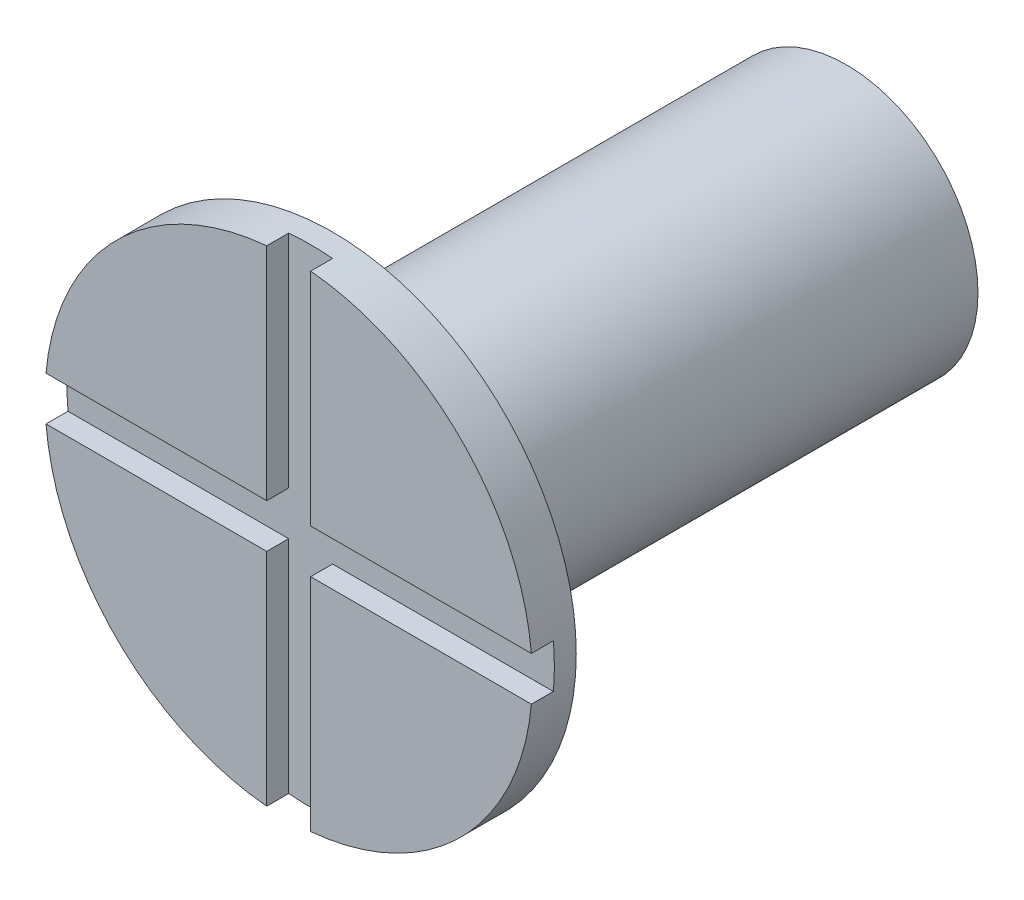
ISO-10303-21;
HEADER;
FILE_DESCRIPTION(('STEP AP214'),'2;1');
FILE_NAME('part.step','',(''),(''),'','','');
FILE_SCHEMA(('AUTOMOTIVE_DESIGN { 1 0 10303 214 1 1 1 1 }'));
ENDSEC;
DATA;
#1=APPLICATION_CONTEXT('core data for automotive mechanical design processes');
#2=APPLICATION_PROTOCOL_DEFINITION('international standard','automotive_design',2000,#1);
#3=PRODUCT_CONTEXT('',#1,'mechanical');
#4=PRODUCT('Part','Part','',(#3));
#5=PRODUCT_RELATED_PRODUCT_CATEGORY('part','',(#4));
#6=PRODUCT_DEFINITION_FORMATION('','',#4);
#7=PRODUCT_DEFINITION_CONTEXT('part definition',#1,'design');
#8=PRODUCT_DEFINITION('design','',#6,#7);
#9=PRODUCT_DEFINITION_SHAPE('','',#8);
#10=(LENGTH_UNIT() NAMED_UNIT(*) SI_UNIT(.MILLI.,.METRE.));
#11=(NAMED_UNIT(*) PLANE_ANGLE_UNIT() SI_UNIT($,.RADIAN.));
#12=(NAMED_UNIT(*) SI_UNIT($,.STERADIAN.) SOLID_ANGLE_UNIT());
#13=UNCERTAINTY_MEASURE_WITH_UNIT(LENGTH_MEASURE(1.E-05),#10,'distance_accuracy_value','');
#14=(GEOMETRIC_REPRESENTATION_CONTEXT(3) GLOBAL_UNCERTAINTY_ASSIGNED_CONTEXT((#13)) GLOBAL_UNIT_ASSIGNED_CONTEXT((#10,
#11,#12)) REPRESENTATION_CONTEXT('',''));
#15=CARTESIAN_POINT('',(0.,0.,0.));
#16=DIRECTION('',(0.,0.,1.));
#17=DIRECTION('',(1.,0.,0.));
#18=AXIS2_PLACEMENT_3D('',#15,#16,#17);
#19=CARTESIAN_POINT('',(0.,0.,5.85));
#20=DIRECTION('',(0.,0.,1.));
#21=DIRECTION('',(1.,0.,0.));
#22=AXIS2_PLACEMENT_3D('',#19,#20,#21);
#23=CYLINDRICAL_SURFACE('',#22,2.775);
#24=DIRECTION('',(0.,0.,1.));
#25=VECTOR('',#24,1.);
#26=CARTESIAN_POINT('',(-0.25,-2.76371579580824,5.85));
#27=LINE('',#26,#25);
#28=CARTESIAN_POINT('',(-0.25,-2.76371579580824,6.35));
#29=VERTEX_POINT('',#28);
#30=CARTESIAN_POINT('',(-0.25,-2.76371579580824,6.1));
#31=VERTEX_POINT('',#30);
#32=EDGE_CURVE('E196',#29,#31,#27,.F.);
#33=ORIENTED_EDGE('',*,*,#32,.F.);
#34=CARTESIAN_POINT('',(0.,0.,6.35));
#35=DIRECTION('',(0.,0.,1.));
#36=DIRECTION('',(1.,0.,0.));
#37=AXIS2_PLACEMENT_3D('',#34,#35,#36);
#38=CIRCLE('',#37,2.775);
#39=CARTESIAN_POINT('',(-2.76371579580824,-0.25,6.35));
#40=VERTEX_POINT('',#39);
#41=EDGE_CURVE('E235',#40,#29,#38,.T.);
#42=ORIENTED_EDGE('',*,*,#41,.F.);
#43=DIRECTION('',(0.,0.,1.));
#44=VECTOR('',#43,1.);
#45=CARTESIAN_POINT('',(-2.76371579580824,-0.25,5.85));
#46=LINE('',#45,#44);
#47=CARTESIAN_POINT('',(-2.76371579580824,-0.25,6.1));
#48=VERTEX_POINT('',#47);
#49=EDGE_CURVE('E186',#48,#40,#46,.T.);
#50=ORIENTED_EDGE('',*,*,#49,.F.);
#51=CARTESIAN_POINT('',(0.,0.,6.1));
#52=DIRECTION('',(0.,0.,1.));
#53=DIRECTION('',(1.,0.,0.));
#54=AXIS2_PLACEMENT_3D('',#51,#52,#53);
#55=CIRCLE('',#54,2.775);
#56=CARTESIAN_POINT('',(-2.76371579580824,0.25,6.1));
#57=VERTEX_POINT('',#56);
#58=EDGE_CURVE('E63',#48,#57,#55,.F.);
#59=ORIENTED_EDGE('',*,*,#58,.T.);
#60=DIRECTION('',(0.,0.,1.));
#61=VECTOR('',#60,1.);
#62=CARTESIAN_POINT('',(-2.76371579580824,0.25,5.85));
#63=LINE('',#62,#61);
#64=CARTESIAN_POINT('',(-2.76371579580824,0.25,6.35));
#65=VERTEX_POINT('',#64);
#66=EDGE_CURVE('E161',#57,#65,#63,.T.);
#67=ORIENTED_EDGE('',*,*,#66,.T.);
#68=CARTESIAN_POINT('',(-0.25,2.76371579580824,6.35));
#69=VERTEX_POINT('',#68);
#70=EDGE_CURVE('E210',#69,#65,#38,.T.);
#71=ORIENTED_EDGE('',*,*,#70,.F.);
#72=DIRECTION('',(0.,0.,1.));
#73=VECTOR('',#72,1.);
#74=CARTESIAN_POINT('',(-0.25,2.76371579580824,5.85));
#75=LINE('',#74,#73);
#76=CARTESIAN_POINT('',(-0.25,2.76371579580824,6.1));
#77=VERTEX_POINT('',#76);
#78=EDGE_CURVE('E82',#77,#69,#75,.T.);
#79=ORIENTED_EDGE('',*,*,#78,.F.);
#80=CARTESIAN_POINT('',(0.25,2.76371579580824,6.1));
#81=VERTEX_POINT('',#80);
#82=EDGE_CURVE('E68',#77,#81,#55,.F.);
#83=ORIENTED_EDGE('',*,*,#82,.T.);
#84=DIRECTION('',(0.,0.,1.));
#85=VECTOR('',#84,1.);
#86=CARTESIAN_POINT('',(0.25,2.76371579580824,5.85));
#87=LINE('',#86,#85);
#88=CARTESIAN_POINT('',(0.25,2.76371579580824,6.35));
#89=VERTEX_POINT('',#88);
#90=EDGE_CURVE('E198',#81,#89,#87,.T.);
#91=ORIENTED_EDGE('',*,*,#90,.T.);
#92=CARTESIAN_POINT('',(2.76371579580824,0.25,6.35));
#93=VERTEX_POINT('',#92);
#94=EDGE_CURVE('E207',#93,#89,#38,.T.);
#95=ORIENTED_EDGE('',*,*,#94,.F.);
#96=DIRECTION('',(0.,0.,1.));
#97=VECTOR('',#96,1.);
#98=CARTESIAN_POINT('',(2.76371579580824,0.25,5.85));
#99=LINE('',#98,#97);
#100=CARTESIAN_POINT('',(2.76371579580824,0.25,6.1));
#101=VERTEX_POINT('',#100);
#102=EDGE_CURVE('E190',#93,#101,#99,.F.);
#103=ORIENTED_EDGE('',*,*,#102,.T.);
#104=CARTESIAN_POINT('',(2.76371579580824,-0.25,6.1));
#105=VERTEX_POINT('',#104);
#106=EDGE_CURVE('E224',#101,#105,#55,.F.);
#107=ORIENTED_EDGE('',*,*,#106,.T.);
#108=DIRECTION('',(0.,0.,1.));
#109=VECTOR('',#108,1.);
#110=CARTESIAN_POINT('',(2.76371579580824,-0.25,5.85));
#111=LINE('',#110,#109);
#112=CARTESIAN_POINT('',(2.76371579580824,-0.25,6.35));
#113=VERTEX_POINT('',#112);
#114=EDGE_CURVE('E188',#113,#105,#111,.F.);
#115=ORIENTED_EDGE('',*,*,#114,.F.);
#116=CARTESIAN_POINT('',(0.25,-2.76371579580824,6.35));
#117=VERTEX_POINT('',#116);
#118=EDGE_CURVE('E202',#117,#113,#38,.T.);
#119=ORIENTED_EDGE('',*,*,#118,.F.);
#120=DIRECTION('',(0.,0.,1.));
#121=VECTOR('',#120,1.);
#122=CARTESIAN_POINT('',(0.25,-2.76371579580824,5.85));
#123=LINE('',#122,#121);
#124=CARTESIAN_POINT('',(0.25,-2.76371579580824,6.1));
#125=VERTEX_POINT('',#124);
#126=EDGE_CURVE('E193',#117,#125,#123,.F.);
#127=ORIENTED_EDGE('',*,*,#126,.T.);
#128=EDGE_CURVE('E12',#125,#31,#55,.F.);
#129=ORIENTED_EDGE('',*,*,#128,.T.);
#130=EDGE_LOOP('',(#33,#42,#50,#59,#67,#71,#79,#83,#91,#95,#103,#107,#115,#119,#127,#129));
#131=FACE_BOUND('',#130,.T.);
#132=CARTESIAN_POINT('',(0.,0.,5.85));
#133=DIRECTION('',(0.,0.,1.));
#134=DIRECTION('',(1.,0.,0.));
#135=AXIS2_PLACEMENT_3D('',#132,#133,#134);
#136=CIRCLE('',#135,2.775);
#137=CARTESIAN_POINT('',(2.775,0.,5.85));
#138=VERTEX_POINT('',#137);
#139=EDGE_CURVE('E203',#138,#138,#136,.T.);
#140=ORIENTED_EDGE('',*,*,#139,.T.);
#141=EDGE_LOOP('',(#140));
#142=FACE_BOUND('',#141,.T.);
#143=ADVANCED_FACE('F59',(#131,#142),#23,.T.);
#144=CARTESIAN_POINT('',(0.,0.,6.35));
#145=DIRECTION('',(0.,0.,1.));
#146=DIRECTION('',(1.,0.,0.));
#147=AXIS2_PLACEMENT_3D('',#144,#145,#146);
#148=PLANE('',#147);
#149=ORIENTED_EDGE('',*,*,#94,.T.);
#150=DIRECTION('',(0.,-1.,0.));
#151=VECTOR('',#150,1.);
#152=CARTESIAN_POINT('',(0.25,0.,6.35));
#153=LINE('',#152,#151);
#154=CARTESIAN_POINT('',(0.25,0.25,6.35));
#155=VERTEX_POINT('',#154);
#156=EDGE_CURVE('E220',#89,#155,#153,.T.);
#157=ORIENTED_EDGE('',*,*,#156,.T.);
#158=DIRECTION('',(1.,0.,0.));
#159=VECTOR('',#158,1.);
#160=CARTESIAN_POINT('',(-3.00427439504212,0.25,6.35));
#161=LINE('',#160,#159);
#162=EDGE_CURVE('E257',#155,#93,#161,.T.);
#163=ORIENTED_EDGE('',*,*,#162,.T.);
#164=EDGE_LOOP('',(#149,#157,#163));
#165=FACE_BOUND('',#164,.T.);
#166=ADVANCED_FACE('F261',(#165),#148,.T.);
#167=DIRECTION('',(1.,0.,0.));
#168=VECTOR('',#167,1.);
#169=CARTESIAN_POINT('',(-3.00427439504212,-0.25,6.35));
#170=LINE('',#169,#168);
#171=CARTESIAN_POINT('',(0.25,-0.25,6.35));
#172=VERTEX_POINT('',#171);
#173=EDGE_CURVE('E246',#172,#113,#170,.T.);
#174=ORIENTED_EDGE('',*,*,#173,.F.);
#175=DIRECTION('',(0.,1.,0.));
#176=VECTOR('',#175,1.);
#177=CARTESIAN_POINT('',(0.25,3.00427439504212,6.35));
#178=LINE('',#177,#176);
#179=EDGE_CURVE('E182',#172,#117,#178,.F.);
#180=ORIENTED_EDGE('',*,*,#179,.T.);
#181=ORIENTED_EDGE('',*,*,#118,.T.);
#182=EDGE_LOOP('',(#174,#180,#181));
#183=FACE_BOUND('',#182,.T.);
#184=ADVANCED_FACE('F245',(#183),#148,.T.);
#185=DIRECTION('',(0.,1.,0.));
#186=VECTOR('',#185,1.);
#187=CARTESIAN_POINT('',(-0.25,3.00427439504212,6.35));
#188=LINE('',#187,#186);
#189=CARTESIAN_POINT('',(-0.25,-0.25,6.35));
#190=VERTEX_POINT('',#189);
#191=EDGE_CURVE('E177',#190,#29,#188,.F.);
#192=ORIENTED_EDGE('',*,*,#191,.F.);
#193=DIRECTION('',(1.,0.,0.));
#194=VECTOR('',#193,1.);
#195=CARTESIAN_POINT('',(0.,-0.25,6.35));
#196=LINE('',#195,#194);
#197=EDGE_CURVE('E219',#40,#190,#196,.T.);
#198=ORIENTED_EDGE('',*,*,#197,.F.);
#199=ORIENTED_EDGE('',*,*,#41,.T.);
#200=EDGE_LOOP('',(#192,#198,#199));
#201=FACE_BOUND('',#200,.T.);
#202=ADVANCED_FACE('F290',(#201),#148,.T.);
#203=CARTESIAN_POINT('',(0.,0.,6.35));
#204=DIRECTION('',(0.,0.,-1.));
#205=DIRECTION('',(-1.,0.,0.));
#206=AXIS2_PLACEMENT_3D('',#203,#204,#205);
#207=CYLINDRICAL_SURFACE('',#206,1.5);
#208=CARTESIAN_POINT('',(0.,0.,0.));
#209=DIRECTION('',(0.,0.,1.));
#210=DIRECTION('',(1.,0.,0.));
#211=AXIS2_PLACEMENT_3D('',#208,#209,#210);
#212=CIRCLE('',#211,1.5);
#213=CARTESIAN_POINT('',(1.5,0.,0.));
#214=VERTEX_POINT('',#213);
#215=EDGE_CURVE('E206',#214,#214,#212,.T.);
#216=ORIENTED_EDGE('',*,*,#215,.T.);
#217=EDGE_LOOP('',(#216));
#218=FACE_BOUND('',#217,.T.);
#219=CARTESIAN_POINT('',(0.,0.,5.85));
#220=DIRECTION('',(0.,0.,1.));
#221=DIRECTION('',(1.,0.,0.));
#222=AXIS2_PLACEMENT_3D('',#219,#220,#221);
#223=CIRCLE('',#222,1.5);
#224=CARTESIAN_POINT('',(1.5,0.,5.85));
#225=VERTEX_POINT('',#224);
#226=EDGE_CURVE('E213',#225,#225,#223,.T.);
#227=ORIENTED_EDGE('',*,*,#226,.F.);
#228=EDGE_LOOP('',(#227));
#229=FACE_BOUND('',#228,.T.);
#230=ADVANCED_FACE('F61',(#218,#229),#207,.T.);
#231=CARTESIAN_POINT('',(0.,0.,0.));
#232=DIRECTION('',(0.,0.,1.));
#233=DIRECTION('',(1.,0.,0.));
#234=AXIS2_PLACEMENT_3D('',#231,#232,#233);
#235=PLANE('',#234);
#236=ORIENTED_EDGE('',*,*,#215,.F.);
#237=EDGE_LOOP('',(#236));
#238=FACE_BOUND('',#237,.T.);
#239=ADVANCED_FACE('F291',(#238),#235,.F.);
#240=CARTESIAN_POINT('',(0.,0.,5.85));
#241=DIRECTION('',(0.,0.,1.));
#242=DIRECTION('',(1.,0.,0.));
#243=AXIS2_PLACEMENT_3D('',#240,#241,#242);
#244=PLANE('',#243);
#245=ORIENTED_EDGE('',*,*,#139,.F.);
#246=EDGE_LOOP('',(#245));
#247=FACE_BOUND('',#246,.T.);
#248=ORIENTED_EDGE('',*,*,#226,.T.);
#249=EDGE_LOOP('',(#248));
#250=FACE_BOUND('',#249,.T.);
#251=ADVANCED_FACE('F288',(#247,#250),#244,.F.);
#252=DIRECTION('',(0.,-1.,0.));
#253=VECTOR('',#252,1.);
#254=CARTESIAN_POINT('',(-0.25,0.,6.35));
#255=LINE('',#254,#253);
#256=CARTESIAN_POINT('',(-0.25,0.25,6.35));
#257=VERTEX_POINT('',#256);
#258=EDGE_CURVE('E166',#69,#257,#255,.T.);
#259=ORIENTED_EDGE('',*,*,#258,.F.);
#260=ORIENTED_EDGE('',*,*,#70,.T.);
#261=DIRECTION('',(1.,0.,0.));
#262=VECTOR('',#261,1.);
#263=CARTESIAN_POINT('',(0.,0.25,6.35));
#264=LINE('',#263,#262);
#265=EDGE_CURVE('E216',#65,#257,#264,.T.);
#266=ORIENTED_EDGE('',*,*,#265,.T.);
#267=EDGE_LOOP('',(#259,#260,#266));
#268=FACE_BOUND('',#267,.T.);
#269=ADVANCED_FACE('F277',(#268),#148,.T.);
#270=CARTESIAN_POINT('',(-0.25,3.00427439504212,6.1));
#271=DIRECTION('',(-1.,0.,0.));
#272=DIRECTION('',(0.,0.,1.));
#273=AXIS2_PLACEMENT_3D('',#270,#271,#272);
#274=PLANE('',#273);
#275=ORIENTED_EDGE('',*,*,#78,.T.);
#276=ORIENTED_EDGE('',*,*,#258,.T.);
#277=DIRECTION('',(0.,0.,1.));
#278=VECTOR('',#277,1.);
#279=CARTESIAN_POINT('',(-0.25,0.25,6.1));
#280=LINE('',#279,#278);
#281=CARTESIAN_POINT('',(-0.25,0.25,6.1));
#282=VERTEX_POINT('',#281);
#283=EDGE_CURVE('E75',#282,#257,#280,.T.);
#284=ORIENTED_EDGE('',*,*,#283,.F.);
#285=DIRECTION('',(0.,1.,0.));
#286=VECTOR('',#285,1.);
#287=CARTESIAN_POINT('',(-0.25,3.00427439504212,6.1));
#288=LINE('',#287,#286);
#289=EDGE_CURVE('E150',#77,#282,#288,.F.);
#290=ORIENTED_EDGE('',*,*,#289,.F.);
#291=EDGE_LOOP('',(#275,#276,#284,#290));
#292=FACE_BOUND('',#291,.T.);
#293=ADVANCED_FACE('F165',(#292),#274,.F.);
#294=CARTESIAN_POINT('',(0.25,3.00427439504212,6.1));
#295=DIRECTION('',(-1.,0.,0.));
#296=DIRECTION('',(0.,0.,1.));
#297=AXIS2_PLACEMENT_3D('',#294,#295,#296);
#298=PLANE('',#297);
#299=DIRECTION('',(0.,1.,0.));
#300=VECTOR('',#299,1.);
#301=CARTESIAN_POINT('',(0.25,3.00427439504212,6.1));
#302=LINE('',#301,#300);
#303=CARTESIAN_POINT('',(0.25,0.25,6.1));
#304=VERTEX_POINT('',#303);
#305=EDGE_CURVE('E179',#81,#304,#302,.F.);
#306=ORIENTED_EDGE('',*,*,#305,.T.);
#307=DIRECTION('',(0.,0.,1.));
#308=VECTOR('',#307,1.);
#309=CARTESIAN_POINT('',(0.25,0.25,6.1));
#310=LINE('',#309,#308);
#311=EDGE_CURVE('E162',#304,#155,#310,.T.);
#312=ORIENTED_EDGE('',*,*,#311,.T.);
#313=ORIENTED_EDGE('',*,*,#156,.F.);
#314=ORIENTED_EDGE('',*,*,#90,.F.);
#315=EDGE_LOOP('',(#306,#312,#313,#314));
#316=FACE_BOUND('',#315,.T.);
#317=ADVANCED_FACE('F266',(#316),#298,.T.);
#318=ORIENTED_EDGE('',*,*,#32,.T.);
#319=CARTESIAN_POINT('',(-0.25,-0.25,6.1));
#320=VERTEX_POINT('',#319);
#321=EDGE_CURVE('E157',#320,#31,#288,.F.);
#322=ORIENTED_EDGE('',*,*,#321,.F.);
#323=DIRECTION('',(0.,0.,1.));
#324=VECTOR('',#323,1.);
#325=CARTESIAN_POINT('',(-0.25,-0.25,6.1));
#326=LINE('',#325,#324);
#327=EDGE_CURVE('E171',#320,#190,#326,.T.);
#328=ORIENTED_EDGE('',*,*,#327,.T.);
#329=ORIENTED_EDGE('',*,*,#191,.T.);
#330=EDGE_LOOP('',(#318,#322,#328,#329));
#331=FACE_BOUND('',#330,.T.);
#332=ADVANCED_FACE('F268',(#331),#274,.F.);
#333=ORIENTED_EDGE('',*,*,#179,.F.);
#334=DIRECTION('',(0.,0.,1.));
#335=VECTOR('',#334,1.);
#336=CARTESIAN_POINT('',(0.25,-0.25,6.1));
#337=LINE('',#336,#335);
#338=CARTESIAN_POINT('',(0.25,-0.25,6.1));
#339=VERTEX_POINT('',#338);
#340=EDGE_CURVE('E168',#339,#172,#337,.T.);
#341=ORIENTED_EDGE('',*,*,#340,.F.);
#342=EDGE_CURVE('E156',#339,#125,#302,.F.);
#343=ORIENTED_EDGE('',*,*,#342,.T.);
#344=ORIENTED_EDGE('',*,*,#126,.F.);
#345=EDGE_LOOP('',(#333,#341,#343,#344));
#346=FACE_BOUND('',#345,.T.);
#347=ADVANCED_FACE('F270',(#346),#298,.T.);
#348=CARTESIAN_POINT('',(0.,0.,6.1));
#349=DIRECTION('',(0.,0.,1.));
#350=DIRECTION('',(1.,0.,0.));
#351=AXIS2_PLACEMENT_3D('',#348,#349,#350);
#352=PLANE('',#351);
#353=ORIENTED_EDGE('',*,*,#342,.F.);
#354=DIRECTION('',(1.,0.,0.));
#355=VECTOR('',#354,1.);
#356=CARTESIAN_POINT('',(-3.00427439504212,-0.25,6.1));
#357=LINE('',#356,#355);
#358=EDGE_CURVE('E251',#339,#105,#357,.T.);
#359=ORIENTED_EDGE('',*,*,#358,.T.);
#360=ORIENTED_EDGE('',*,*,#106,.F.);
#361=DIRECTION('',(1.,0.,0.));
#362=VECTOR('',#361,1.);
#363=CARTESIAN_POINT('',(-3.00427439504212,0.25,6.1));
#364=LINE('',#363,#362);
#365=EDGE_CURVE('E163',#304,#101,#364,.T.);
#366=ORIENTED_EDGE('',*,*,#365,.F.);
#367=ORIENTED_EDGE('',*,*,#305,.F.);
#368=ORIENTED_EDGE('',*,*,#82,.F.);
#369=ORIENTED_EDGE('',*,*,#289,.T.);
#370=EDGE_CURVE('E152',#57,#282,#364,.T.);
#371=ORIENTED_EDGE('',*,*,#370,.F.);
#372=ORIENTED_EDGE('',*,*,#58,.F.);
#373=EDGE_CURVE('E256',#48,#320,#357,.T.);
#374=ORIENTED_EDGE('',*,*,#373,.T.);
#375=ORIENTED_EDGE('',*,*,#321,.T.);
#376=ORIENTED_EDGE('',*,*,#128,.F.);
#377=EDGE_LOOP('',(#353,#359,#360,#366,#367,#368,#369,#371,#372,#374,#375,#376));
#378=FACE_BOUND('',#377,.T.);
#379=ADVANCED_FACE('F151',(#378),#352,.T.);
#380=CARTESIAN_POINT('',(-3.00427439504212,0.25,6.1));
#381=DIRECTION('',(0.,-1.,0.));
#382=DIRECTION('',(0.,0.,-1.));
#383=AXIS2_PLACEMENT_3D('',#380,#381,#382);
#384=PLANE('',#383);
#385=ORIENTED_EDGE('',*,*,#162,.F.);
#386=ORIENTED_EDGE('',*,*,#311,.F.);
#387=ORIENTED_EDGE('',*,*,#365,.T.);
#388=ORIENTED_EDGE('',*,*,#102,.F.);
#389=EDGE_LOOP('',(#385,#386,#387,#388));
#390=FACE_BOUND('',#389,.T.);
#391=ADVANCED_FACE('F264',(#390),#384,.T.);
#392=CARTESIAN_POINT('',(-3.00427439504212,-0.25,6.1));
#393=DIRECTION('',(0.,-1.,0.));
#394=DIRECTION('',(0.,0.,-1.));
#395=AXIS2_PLACEMENT_3D('',#392,#393,#394);
#396=PLANE('',#395);
#397=ORIENTED_EDGE('',*,*,#114,.T.);
#398=ORIENTED_EDGE('',*,*,#358,.F.);
#399=ORIENTED_EDGE('',*,*,#340,.T.);
#400=ORIENTED_EDGE('',*,*,#173,.T.);
#401=EDGE_LOOP('',(#397,#398,#399,#400));
#402=FACE_BOUND('',#401,.T.);
#403=ADVANCED_FACE('F250',(#402),#396,.F.);
#404=ORIENTED_EDGE('',*,*,#49,.T.);
#405=ORIENTED_EDGE('',*,*,#197,.T.);
#406=ORIENTED_EDGE('',*,*,#327,.F.);
#407=ORIENTED_EDGE('',*,*,#373,.F.);
#408=EDGE_LOOP('',(#404,#405,#406,#407));
#409=FACE_BOUND('',#408,.T.);
#410=ADVANCED_FACE('F315',(#409),#396,.F.);
#411=ORIENTED_EDGE('',*,*,#370,.T.);
#412=ORIENTED_EDGE('',*,*,#283,.T.);
#413=ORIENTED_EDGE('',*,*,#265,.F.);
#414=ORIENTED_EDGE('',*,*,#66,.F.);
#415=EDGE_LOOP('',(#411,#412,#413,#414));
#416=FACE_BOUND('',#415,.T.);
#417=ADVANCED_FACE('F159',(#416),#384,.T.);
#418=CLOSED_SHELL('',(#143,#166,#184,#202,#230,#239,#251,#269,#293,#317,#332,#347,#379,#391,
#403,#410,#417));
#419=MANIFOLD_SOLID_BREP('B2',#418);
#420=ADVANCED_BREP_SHAPE_REPRESENTATION('',(#18,#419),#14);
#421=SHAPE_DEFINITION_REPRESENTATION(#9,#420);
ENDSEC;
END-ISO-10303-21;
